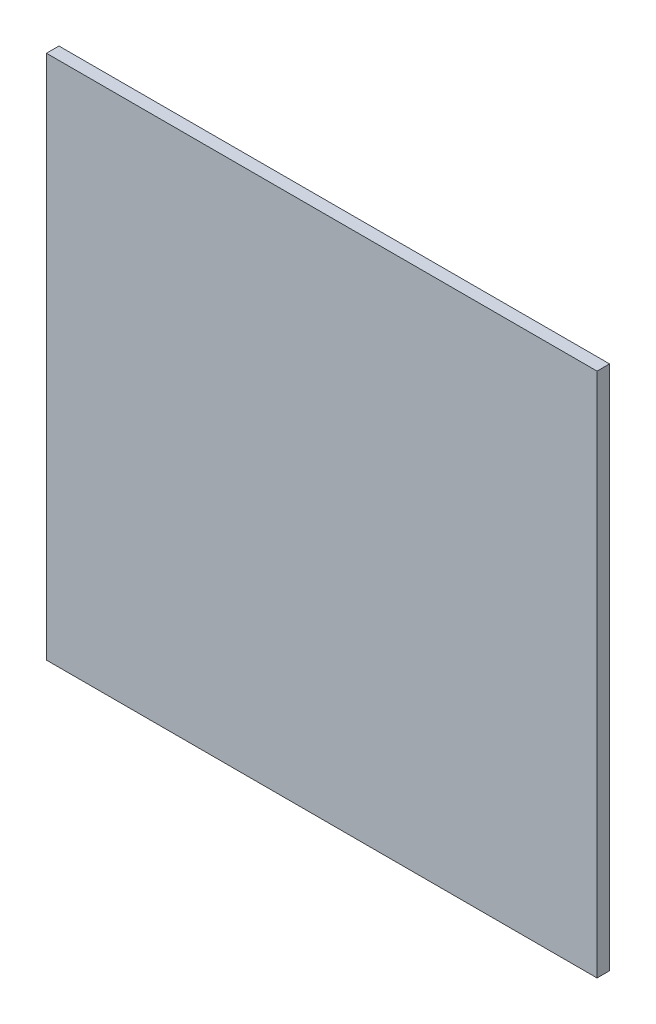
ISO-10303-21;
HEADER;
FILE_DESCRIPTION(('STEP AP214'),'2;1');
FILE_NAME('part.step','',(''),(''),'','','');
FILE_SCHEMA(('AUTOMOTIVE_DESIGN { 1 0 10303 214 1 1 1 1 }'));
ENDSEC;
DATA;
#1=APPLICATION_CONTEXT('core data for automotive mechanical design processes');
#2=APPLICATION_PROTOCOL_DEFINITION('international standard','automotive_design',2000,#1);
#3=PRODUCT_CONTEXT('',#1,'mechanical');
#4=PRODUCT('Part','Part','',(#3));
#5=PRODUCT_RELATED_PRODUCT_CATEGORY('part','',(#4));
#6=PRODUCT_DEFINITION_FORMATION('','',#4);
#7=PRODUCT_DEFINITION_CONTEXT('part definition',#1,'design');
#8=PRODUCT_DEFINITION('design','',#6,#7);
#9=PRODUCT_DEFINITION_SHAPE('','',#8);
#10=(LENGTH_UNIT() NAMED_UNIT(*) SI_UNIT(.MILLI.,.METRE.));
#11=(NAMED_UNIT(*) PLANE_ANGLE_UNIT() SI_UNIT($,.RADIAN.));
#12=(NAMED_UNIT(*) SI_UNIT($,.STERADIAN.) SOLID_ANGLE_UNIT());
#13=UNCERTAINTY_MEASURE_WITH_UNIT(LENGTH_MEASURE(1.E-05),#10,'distance_accuracy_value','');
#14=(GEOMETRIC_REPRESENTATION_CONTEXT(3) GLOBAL_UNCERTAINTY_ASSIGNED_CONTEXT((#13)) GLOBAL_UNIT_ASSIGNED_CONTEXT((#10,
#11,#12)) REPRESENTATION_CONTEXT('',''));
#15=CARTESIAN_POINT('',(0.,0.,0.));
#16=DIRECTION('',(0.,0.,1.));
#17=DIRECTION('',(1.,0.,0.));
#18=AXIS2_PLACEMENT_3D('',#15,#16,#17);
#19=CARTESIAN_POINT('',(-22.,-21.,1.));
#20=DIRECTION('',(1.,0.,0.));
#21=DIRECTION('',(0.,0.,-1.));
#22=AXIS2_PLACEMENT_3D('',#19,#20,#21);
#23=PLANE('',#22);
#24=DIRECTION('',(0.,-1.,0.));
#25=VECTOR('',#24,1.);
#26=CARTESIAN_POINT('',(-22.,-21.,0.));
#27=LINE('',#26,#25);
#28=CARTESIAN_POINT('',(-22.,21.,0.));
#29=VERTEX_POINT('',#28);
#30=CARTESIAN_POINT('',(-22.,-21.,0.));
#31=VERTEX_POINT('',#30);
#32=EDGE_CURVE('E96',#29,#31,#27,.T.);
#33=ORIENTED_EDGE('',*,*,#32,.T.);
#34=DIRECTION('',(0.,0.,-1.));
#35=VECTOR('',#34,1.);
#36=CARTESIAN_POINT('',(-22.,-21.,1.));
#37=LINE('',#36,#35);
#38=CARTESIAN_POINT('',(-22.,-21.,1.));
#39=VERTEX_POINT('',#38);
#40=EDGE_CURVE('E11',#39,#31,#37,.T.);
#41=ORIENTED_EDGE('',*,*,#40,.F.);
#42=DIRECTION('',(0.,-1.,0.));
#43=VECTOR('',#42,1.);
#44=CARTESIAN_POINT('',(-22.,-21.,1.));
#45=LINE('',#44,#43);
#46=CARTESIAN_POINT('',(-22.,21.,1.));
#47=VERTEX_POINT('',#46);
#48=EDGE_CURVE('E84',#47,#39,#45,.T.);
#49=ORIENTED_EDGE('',*,*,#48,.F.);
#50=DIRECTION('',(0.,0.,-1.));
#51=VECTOR('',#50,1.);
#52=CARTESIAN_POINT('',(-22.,21.,1.));
#53=LINE('',#52,#51);
#54=EDGE_CURVE('E92',#47,#29,#53,.T.);
#55=ORIENTED_EDGE('',*,*,#54,.T.);
#56=EDGE_LOOP('',(#33,#41,#49,#55));
#57=FACE_BOUND('',#56,.T.);
#58=ADVANCED_FACE('F33',(#57),#23,.F.);
#59=CARTESIAN_POINT('',(22.,-21.,1.));
#60=DIRECTION('',(0.,1.,0.));
#61=DIRECTION('',(-1.,0.,0.));
#62=AXIS2_PLACEMENT_3D('',#59,#60,#61);
#63=PLANE('',#62);
#64=DIRECTION('',(1.,0.,0.));
#65=VECTOR('',#64,1.);
#66=CARTESIAN_POINT('',(22.,-21.,0.));
#67=LINE('',#66,#65);
#68=CARTESIAN_POINT('',(22.,-21.,0.));
#69=VERTEX_POINT('',#68);
#70=EDGE_CURVE('E88',#31,#69,#67,.T.);
#71=ORIENTED_EDGE('',*,*,#70,.T.);
#72=DIRECTION('',(0.,0.,-1.));
#73=VECTOR('',#72,1.);
#74=CARTESIAN_POINT('',(22.,-21.,1.));
#75=LINE('',#74,#73);
#76=CARTESIAN_POINT('',(22.,-21.,1.));
#77=VERTEX_POINT('',#76);
#78=EDGE_CURVE('E41',#77,#69,#75,.T.);
#79=ORIENTED_EDGE('',*,*,#78,.F.);
#80=DIRECTION('',(1.,0.,0.));
#81=VECTOR('',#80,1.);
#82=CARTESIAN_POINT('',(22.,-21.,1.));
#83=LINE('',#82,#81);
#84=EDGE_CURVE('E79',#39,#77,#83,.T.);
#85=ORIENTED_EDGE('',*,*,#84,.F.);
#86=ORIENTED_EDGE('',*,*,#40,.T.);
#87=EDGE_LOOP('',(#71,#79,#85,#86));
#88=FACE_BOUND('',#87,.T.);
#89=ADVANCED_FACE('F87',(#88),#63,.F.);
#90=CARTESIAN_POINT('',(22.,-21.,1.));
#91=DIRECTION('',(-1.,0.,0.));
#92=DIRECTION('',(0.,0.,1.));
#93=AXIS2_PLACEMENT_3D('',#90,#91,#92);
#94=PLANE('',#93);
#95=DIRECTION('',(0.,1.,0.));
#96=VECTOR('',#95,1.);
#97=CARTESIAN_POINT('',(22.,-21.,0.));
#98=LINE('',#97,#96);
#99=CARTESIAN_POINT('',(22.,21.,0.));
#100=VERTEX_POINT('',#99);
#101=EDGE_CURVE('E66',#69,#100,#98,.T.);
#102=ORIENTED_EDGE('',*,*,#101,.T.);
#103=DIRECTION('',(0.,0.,-1.));
#104=VECTOR('',#103,1.);
#105=CARTESIAN_POINT('',(22.,21.,1.));
#106=LINE('',#105,#104);
#107=CARTESIAN_POINT('',(22.,21.,1.));
#108=VERTEX_POINT('',#107);
#109=EDGE_CURVE('E89',#108,#100,#106,.T.);
#110=ORIENTED_EDGE('',*,*,#109,.F.);
#111=DIRECTION('',(0.,1.,0.));
#112=VECTOR('',#111,1.);
#113=CARTESIAN_POINT('',(22.,-21.,1.));
#114=LINE('',#113,#112);
#115=EDGE_CURVE('E82',#77,#108,#114,.T.);
#116=ORIENTED_EDGE('',*,*,#115,.F.);
#117=ORIENTED_EDGE('',*,*,#78,.T.);
#118=EDGE_LOOP('',(#102,#110,#116,#117));
#119=FACE_BOUND('',#118,.T.);
#120=ADVANCED_FACE('F90',(#119),#94,.F.);
#121=CARTESIAN_POINT('',(22.,21.,1.));
#122=DIRECTION('',(0.,-1.,0.));
#123=DIRECTION('',(0.,0.,-1.));
#124=AXIS2_PLACEMENT_3D('',#121,#122,#123);
#125=PLANE('',#124);
#126=DIRECTION('',(-1.,0.,0.));
#127=VECTOR('',#126,1.);
#128=CARTESIAN_POINT('',(22.,21.,0.));
#129=LINE('',#128,#127);
#130=EDGE_CURVE('E72',#100,#29,#129,.T.);
#131=ORIENTED_EDGE('',*,*,#130,.T.);
#132=ORIENTED_EDGE('',*,*,#54,.F.);
#133=DIRECTION('',(-1.,0.,0.));
#134=VECTOR('',#133,1.);
#135=CARTESIAN_POINT('',(22.,21.,1.));
#136=LINE('',#135,#134);
#137=EDGE_CURVE('E49',#108,#47,#136,.T.);
#138=ORIENTED_EDGE('',*,*,#137,.F.);
#139=ORIENTED_EDGE('',*,*,#109,.T.);
#140=EDGE_LOOP('',(#131,#132,#138,#139));
#141=FACE_BOUND('',#140,.T.);
#142=ADVANCED_FACE('F103',(#141),#125,.F.);
#143=CARTESIAN_POINT('',(0.,0.,1.));
#144=DIRECTION('',(0.,0.,1.));
#145=DIRECTION('',(1.,0.,0.));
#146=AXIS2_PLACEMENT_3D('',#143,#144,#145);
#147=PLANE('',#146);
#148=ORIENTED_EDGE('',*,*,#48,.T.);
#149=ORIENTED_EDGE('',*,*,#84,.T.);
#150=ORIENTED_EDGE('',*,*,#115,.T.);
#151=ORIENTED_EDGE('',*,*,#137,.T.);
#152=EDGE_LOOP('',(#148,#149,#150,#151));
#153=FACE_BOUND('',#152,.T.);
#154=ADVANCED_FACE('F80',(#153),#147,.T.);
#155=CARTESIAN_POINT('',(0.,0.,0.));
#156=DIRECTION('',(0.,0.,1.));
#157=DIRECTION('',(1.,0.,0.));
#158=AXIS2_PLACEMENT_3D('',#155,#156,#157);
#159=PLANE('',#158);
#160=ORIENTED_EDGE('',*,*,#32,.F.);
#161=ORIENTED_EDGE('',*,*,#130,.F.);
#162=ORIENTED_EDGE('',*,*,#101,.F.);
#163=ORIENTED_EDGE('',*,*,#70,.F.);
#164=EDGE_LOOP('',(#160,#161,#162,#163));
#165=FACE_BOUND('',#164,.T.);
#166=ADVANCED_FACE('F106',(#165),#159,.F.);
#167=CLOSED_SHELL('',(#58,#89,#120,#142,#154,#166));
#168=MANIFOLD_SOLID_BREP('B2',#167);
#169=ADVANCED_BREP_SHAPE_REPRESENTATION('',(#18,#168),#14);
#170=SHAPE_DEFINITION_REPRESENTATION(#9,#169);
ENDSEC;
END-ISO-10303-21;
